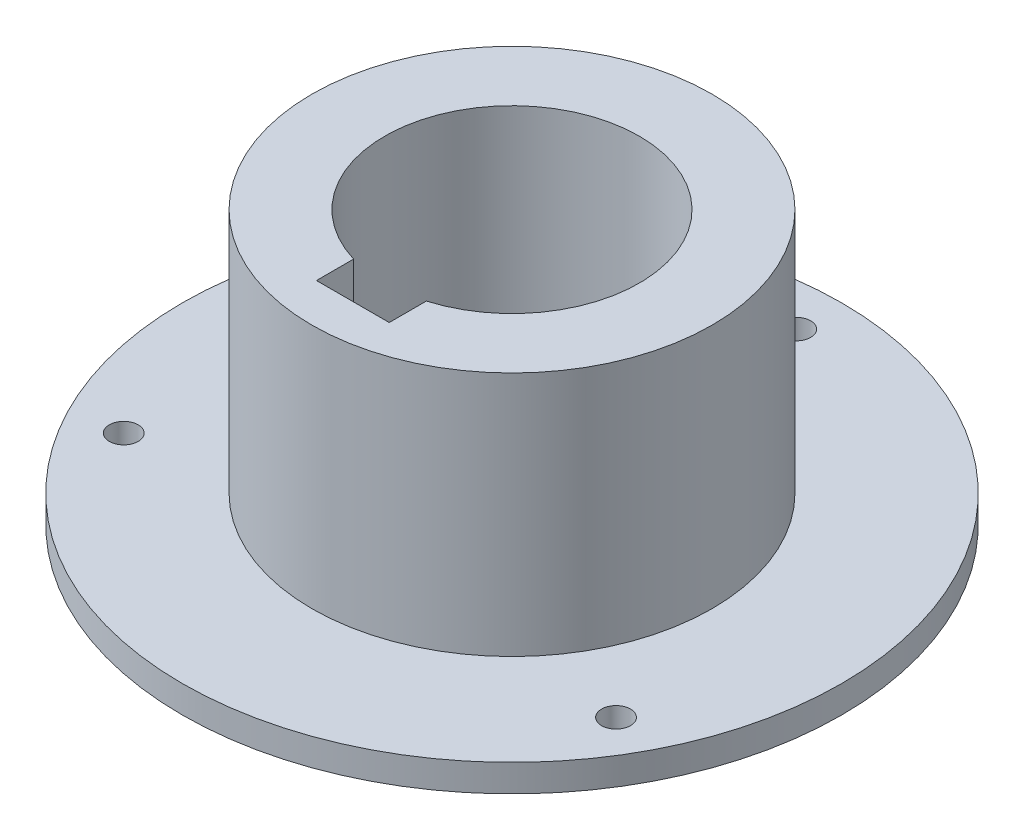
ISO-10303-21;
HEADER;
FILE_DESCRIPTION(('STEP AP214'),'2;1');
FILE_NAME('part.step','',(''),(''),'','','');
FILE_SCHEMA(('AUTOMOTIVE_DESIGN { 1 0 10303 214 1 1 1 1 }'));
ENDSEC;
DATA;
#1=APPLICATION_CONTEXT('core data for automotive mechanical design processes');
#2=APPLICATION_PROTOCOL_DEFINITION('international standard','automotive_design',2000,#1);
#3=PRODUCT_CONTEXT('',#1,'mechanical');
#4=PRODUCT('Part','Part','',(#3));
#5=PRODUCT_RELATED_PRODUCT_CATEGORY('part','',(#4));
#6=PRODUCT_DEFINITION_FORMATION('','',#4);
#7=PRODUCT_DEFINITION_CONTEXT('part definition',#1,'design');
#8=PRODUCT_DEFINITION('design','',#6,#7);
#9=PRODUCT_DEFINITION_SHAPE('','',#8);
#10=(LENGTH_UNIT() NAMED_UNIT(*) SI_UNIT(.MILLI.,.METRE.));
#11=(NAMED_UNIT(*) PLANE_ANGLE_UNIT() SI_UNIT($,.RADIAN.));
#12=(NAMED_UNIT(*) SI_UNIT($,.STERADIAN.) SOLID_ANGLE_UNIT());
#13=UNCERTAINTY_MEASURE_WITH_UNIT(LENGTH_MEASURE(1.E-05),#10,'distance_accuracy_value','');
#14=(GEOMETRIC_REPRESENTATION_CONTEXT(3) GLOBAL_UNCERTAINTY_ASSIGNED_CONTEXT((#13)) GLOBAL_UNIT_ASSIGNED_CONTEXT((#10,
#11,#12)) REPRESENTATION_CONTEXT('',''));
#15=CARTESIAN_POINT('',(0.,0.,0.));
#16=DIRECTION('',(0.,0.,1.));
#17=DIRECTION('',(1.,0.,0.));
#18=AXIS2_PLACEMENT_3D('',#15,#16,#17);
#19=CARTESIAN_POINT('',(0.,30.,0.));
#20=DIRECTION('',(0.,-1.,0.));
#21=DIRECTION('',(0.,0.,-1.));
#22=AXIS2_PLACEMENT_3D('',#19,#20,#21);
#23=PLANE('',#22);
#24=CARTESIAN_POINT('',(0.,30.,0.));
#25=DIRECTION('',(0.,-1.,0.));
#26=DIRECTION('',(0.,0.,-1.));
#27=AXIS2_PLACEMENT_3D('',#24,#25,#26);
#28=CIRCLE('',#27,22.);
#29=CARTESIAN_POINT('',(0.,30.,-22.));
#30=VERTEX_POINT('',#29);
#31=EDGE_CURVE('E114',#30,#30,#28,.T.);
#32=ORIENTED_EDGE('',*,*,#31,.F.);
#33=EDGE_LOOP('',(#32));
#34=FACE_BOUND('',#33,.T.);
#35=DIRECTION('',(1.,0.,0.));
#36=VECTOR('',#35,1.);
#37=CARTESIAN_POINT('',(0.,30.,17.5));
#38=LINE('',#37,#36);
#39=CARTESIAN_POINT('',(-4.,30.,17.5));
#40=VERTEX_POINT('',#39);
#41=CARTESIAN_POINT('',(4.,30.,17.5));
#42=VERTEX_POINT('',#41);
#43=EDGE_CURVE('E142',#40,#42,#38,.T.);
#44=ORIENTED_EDGE('',*,*,#43,.F.);
#45=DIRECTION('',(0.,0.,1.));
#46=VECTOR('',#45,1.);
#47=CARTESIAN_POINT('',(-4.,30.,17.5));
#48=LINE('',#47,#46);
#49=CARTESIAN_POINT('',(-4.,30.,13.4164078649987));
#50=VERTEX_POINT('',#49);
#51=EDGE_CURVE('E77',#50,#40,#48,.T.);
#52=ORIENTED_EDGE('',*,*,#51,.F.);
#53=CARTESIAN_POINT('',(0.,30.,0.));
#54=DIRECTION('',(0.,-1.,0.));
#55=DIRECTION('',(0.,0.,-1.));
#56=AXIS2_PLACEMENT_3D('',#53,#54,#55);
#57=CIRCLE('',#56,14.);
#58=CARTESIAN_POINT('',(4.,30.,13.4164078649987));
#59=VERTEX_POINT('',#58);
#60=EDGE_CURVE('E44',#50,#59,#57,.T.);
#61=ORIENTED_EDGE('',*,*,#60,.T.);
#62=DIRECTION('',(0.,0.,-1.));
#63=VECTOR('',#62,1.);
#64=CARTESIAN_POINT('',(4.,30.,12.9194536976706));
#65=LINE('',#64,#63);
#66=EDGE_CURVE('E140',#42,#59,#65,.T.);
#67=ORIENTED_EDGE('',*,*,#66,.F.);
#68=EDGE_LOOP('',(#44,#52,#61,#67));
#69=FACE_BOUND('',#68,.T.);
#70=ADVANCED_FACE('F37',(#34,#69),#23,.F.);
#71=CARTESIAN_POINT('',(0.,0.,0.));
#72=DIRECTION('',(0.,-1.,0.));
#73=DIRECTION('',(0.,0.,-1.));
#74=AXIS2_PLACEMENT_3D('',#71,#72,#73);
#75=CYLINDRICAL_SURFACE('',#74,14.);
#76=ORIENTED_EDGE('',*,*,#60,.F.);
#77=DIRECTION('',(0.,-1.,0.));
#78=VECTOR('',#77,1.);
#79=CARTESIAN_POINT('',(-4.,0.,13.4164078649987));
#80=LINE('',#79,#78);
#81=CARTESIAN_POINT('',(-4.,-2.,13.4164078649987));
#82=VERTEX_POINT('',#81);
#83=EDGE_CURVE('E135',#50,#82,#80,.T.);
#84=ORIENTED_EDGE('',*,*,#83,.T.);
#85=CARTESIAN_POINT('',(0.,-2.,0.));
#86=DIRECTION('',(0.,-1.,0.));
#87=DIRECTION('',(0.,0.,-1.));
#88=AXIS2_PLACEMENT_3D('',#85,#86,#87);
#89=CIRCLE('',#88,14.);
#90=CARTESIAN_POINT('',(4.,-2.,13.4164078649987));
#91=VERTEX_POINT('',#90);
#92=EDGE_CURVE('E93',#82,#91,#89,.T.);
#93=ORIENTED_EDGE('',*,*,#92,.T.);
#94=DIRECTION('',(0.,-1.,0.));
#95=VECTOR('',#94,1.);
#96=CARTESIAN_POINT('',(4.,0.,13.4164078649987));
#97=LINE('',#96,#95);
#98=EDGE_CURVE('E81',#91,#59,#97,.F.);
#99=ORIENTED_EDGE('',*,*,#98,.T.);
#100=EDGE_LOOP('',(#76,#84,#93,#99));
#101=FACE_BOUND('',#100,.T.);
#102=ADVANCED_FACE('F148',(#101),#75,.F.);
#103=CARTESIAN_POINT('',(0.,-2.,0.));
#104=DIRECTION('',(0.,1.,0.));
#105=DIRECTION('',(0.,0.,1.));
#106=AXIS2_PLACEMENT_3D('',#103,#104,#105);
#107=PLANE('',#106);
#108=ORIENTED_EDGE('',*,*,#92,.F.);
#109=DIRECTION('',(0.,0.,1.));
#110=VECTOR('',#109,1.);
#111=CARTESIAN_POINT('',(-4.,-2.,0.));
#112=LINE('',#111,#110);
#113=CARTESIAN_POINT('',(-4.,-2.,17.5));
#114=VERTEX_POINT('',#113);
#115=EDGE_CURVE('E11',#82,#114,#112,.T.);
#116=ORIENTED_EDGE('',*,*,#115,.T.);
#117=DIRECTION('',(1.,0.,0.));
#118=VECTOR('',#117,1.);
#119=CARTESIAN_POINT('',(0.,-2.,17.5));
#120=LINE('',#119,#118);
#121=CARTESIAN_POINT('',(4.,-2.,17.5));
#122=VERTEX_POINT('',#121);
#123=EDGE_CURVE('E85',#114,#122,#120,.T.);
#124=ORIENTED_EDGE('',*,*,#123,.T.);
#125=DIRECTION('',(0.,0.,-1.));
#126=VECTOR('',#125,1.);
#127=CARTESIAN_POINT('',(4.,-2.,12.9194536976706));
#128=LINE('',#127,#126);
#129=EDGE_CURVE('E51',#122,#91,#128,.T.);
#130=ORIENTED_EDGE('',*,*,#129,.T.);
#131=EDGE_LOOP('',(#108,#116,#124,#130));
#132=FACE_BOUND('',#131,.T.);
#133=CARTESIAN_POINT('',(0.,-2.,0.));
#134=DIRECTION('',(0.,-1.,0.));
#135=DIRECTION('',(0.,0.,-1.));
#136=AXIS2_PLACEMENT_3D('',#133,#134,#135);
#137=CIRCLE('',#136,19.25);
#138=CARTESIAN_POINT('',(0.,-2.,-19.25));
#139=VERTEX_POINT('',#138);
#140=EDGE_CURVE('E96',#139,#139,#137,.T.);
#141=ORIENTED_EDGE('',*,*,#140,.T.);
#142=EDGE_LOOP('',(#141));
#143=FACE_BOUND('',#142,.T.);
#144=ADVANCED_FACE('F90',(#132,#143),#107,.F.);
#145=CARTESIAN_POINT('',(0.,0.,0.));
#146=DIRECTION('',(0.,-1.,0.));
#147=DIRECTION('',(0.,0.,-1.));
#148=AXIS2_PLACEMENT_3D('',#145,#146,#147);
#149=CYLINDRICAL_SURFACE('',#148,19.25);
#150=CARTESIAN_POINT('',(0.,0.,0.));
#151=DIRECTION('',(0.,-1.,0.));
#152=DIRECTION('',(0.,0.,-1.));
#153=AXIS2_PLACEMENT_3D('',#150,#151,#152);
#154=CIRCLE('',#153,19.25);
#155=CARTESIAN_POINT('',(0.,0.,-19.25));
#156=VERTEX_POINT('',#155);
#157=EDGE_CURVE('E100',#156,#156,#154,.T.);
#158=ORIENTED_EDGE('',*,*,#157,.T.);
#159=EDGE_LOOP('',(#158));
#160=FACE_BOUND('',#159,.T.);
#161=ORIENTED_EDGE('',*,*,#140,.F.);
#162=EDGE_LOOP('',(#161));
#163=FACE_BOUND('',#162,.T.);
#164=ADVANCED_FACE('F154',(#160,#163),#149,.T.);
#165=CARTESIAN_POINT('',(0.,0.,0.));
#166=DIRECTION('',(0.,-1.,0.));
#167=DIRECTION('',(0.,0.,-1.));
#168=AXIS2_PLACEMENT_3D('',#165,#166,#167);
#169=PLANE('',#168);
#170=CARTESIAN_POINT('',(-27.0632938682639,0.,15.6249999999997));
#171=DIRECTION('',(0.,-1.,0.));
#172=DIRECTION('',(0.,0.,-1.));
#173=AXIS2_PLACEMENT_3D('',#170,#171,#172);
#174=CIRCLE('',#173,1.5875);
#175=CARTESIAN_POINT('',(-27.0632938682639,0.,14.0374999999997));
#176=VERTEX_POINT('',#175);
#177=EDGE_CURVE('E129',#176,#176,#174,.T.);
#178=ORIENTED_EDGE('',*,*,#177,.F.);
#179=EDGE_LOOP('',(#178));
#180=FACE_BOUND('',#179,.T.);
#181=CARTESIAN_POINT('',(27.0632938682636,0.,15.6250000000001));
#182=DIRECTION('',(0.,-1.,0.));
#183=DIRECTION('',(0.,0.,-1.));
#184=AXIS2_PLACEMENT_3D('',#181,#182,#183);
#185=CIRCLE('',#184,1.5875);
#186=CARTESIAN_POINT('',(27.0632938682636,0.,14.0375000000001));
#187=VERTEX_POINT('',#186);
#188=EDGE_CURVE('E123',#187,#187,#185,.T.);
#189=ORIENTED_EDGE('',*,*,#188,.F.);
#190=EDGE_LOOP('',(#189));
#191=FACE_BOUND('',#190,.T.);
#192=CARTESIAN_POINT('',(0.,0.,-31.25));
#193=DIRECTION('',(0.,-1.,0.));
#194=DIRECTION('',(0.,0.,-1.));
#195=AXIS2_PLACEMENT_3D('',#192,#193,#194);
#196=CIRCLE('',#195,1.5875);
#197=CARTESIAN_POINT('',(0.,0.,-32.8375));
#198=VERTEX_POINT('',#197);
#199=EDGE_CURVE('E117',#198,#198,#196,.T.);
#200=ORIENTED_EDGE('',*,*,#199,.F.);
#201=EDGE_LOOP('',(#200));
#202=FACE_BOUND('',#201,.T.);
#203=CARTESIAN_POINT('',(0.,0.,0.));
#204=DIRECTION('',(0.,-1.,0.));
#205=DIRECTION('',(0.,0.,-1.));
#206=AXIS2_PLACEMENT_3D('',#203,#204,#205);
#207=CIRCLE('',#206,36.25);
#208=CARTESIAN_POINT('',(0.,0.,-36.25));
#209=VERTEX_POINT('',#208);
#210=EDGE_CURVE('E105',#209,#209,#207,.T.);
#211=ORIENTED_EDGE('',*,*,#210,.T.);
#212=EDGE_LOOP('',(#211));
#213=FACE_BOUND('',#212,.T.);
#214=ORIENTED_EDGE('',*,*,#157,.F.);
#215=EDGE_LOOP('',(#214));
#216=FACE_BOUND('',#215,.T.);
#217=ADVANCED_FACE('F160',(#180,#191,#202,#213,#216),#169,.T.);
#218=CARTESIAN_POINT('',(0.,0.,0.));
#219=DIRECTION('',(0.,-1.,0.));
#220=DIRECTION('',(0.,0.,-1.));
#221=AXIS2_PLACEMENT_3D('',#218,#219,#220);
#222=CYLINDRICAL_SURFACE('',#221,36.25);
#223=ORIENTED_EDGE('',*,*,#210,.F.);
#224=EDGE_LOOP('',(#223));
#225=FACE_BOUND('',#224,.T.);
#226=CARTESIAN_POINT('',(0.,3.,0.));
#227=DIRECTION('',(0.,-1.,0.));
#228=DIRECTION('',(0.,0.,-1.));
#229=AXIS2_PLACEMENT_3D('',#226,#227,#228);
#230=CIRCLE('',#229,36.25);
#231=CARTESIAN_POINT('',(0.,3.,-36.25));
#232=VERTEX_POINT('',#231);
#233=EDGE_CURVE('E108',#232,#232,#230,.T.);
#234=ORIENTED_EDGE('',*,*,#233,.T.);
#235=EDGE_LOOP('',(#234));
#236=FACE_BOUND('',#235,.T.);
#237=ADVANCED_FACE('F164',(#225,#236),#222,.T.);
#238=CARTESIAN_POINT('',(0.,3.,0.));
#239=DIRECTION('',(0.,-1.,0.));
#240=DIRECTION('',(0.,0.,-1.));
#241=AXIS2_PLACEMENT_3D('',#238,#239,#240);
#242=PLANE('',#241);
#243=CARTESIAN_POINT('',(-27.0632938682639,3.,15.6249999999997));
#244=DIRECTION('',(0.,1.,0.));
#245=DIRECTION('',(0.,0.,1.));
#246=AXIS2_PLACEMENT_3D('',#243,#244,#245);
#247=CIRCLE('',#246,1.5875);
#248=CARTESIAN_POINT('',(-27.0632938682639,3.,17.2124999999997));
#249=VERTEX_POINT('',#248);
#250=EDGE_CURVE('E132',#249,#249,#247,.T.);
#251=ORIENTED_EDGE('',*,*,#250,.F.);
#252=EDGE_LOOP('',(#251));
#253=FACE_BOUND('',#252,.T.);
#254=CARTESIAN_POINT('',(27.0632938682636,3.,15.6250000000001));
#255=DIRECTION('',(0.,1.,0.));
#256=DIRECTION('',(0.,0.,1.));
#257=AXIS2_PLACEMENT_3D('',#254,#255,#256);
#258=CIRCLE('',#257,1.5875);
#259=CARTESIAN_POINT('',(27.0632938682636,3.,17.2125000000001));
#260=VERTEX_POINT('',#259);
#261=EDGE_CURVE('E126',#260,#260,#258,.T.);
#262=ORIENTED_EDGE('',*,*,#261,.F.);
#263=EDGE_LOOP('',(#262));
#264=FACE_BOUND('',#263,.T.);
#265=CARTESIAN_POINT('',(0.,3.,-31.25));
#266=DIRECTION('',(0.,1.,0.));
#267=DIRECTION('',(0.,0.,1.));
#268=AXIS2_PLACEMENT_3D('',#265,#266,#267);
#269=CIRCLE('',#268,1.5875);
#270=CARTESIAN_POINT('',(0.,3.,-29.6625));
#271=VERTEX_POINT('',#270);
#272=EDGE_CURVE('E120',#271,#271,#269,.T.);
#273=ORIENTED_EDGE('',*,*,#272,.F.);
#274=EDGE_LOOP('',(#273));
#275=FACE_BOUND('',#274,.T.);
#276=ORIENTED_EDGE('',*,*,#233,.F.);
#277=EDGE_LOOP('',(#276));
#278=FACE_BOUND('',#277,.T.);
#279=CARTESIAN_POINT('',(0.,3.,0.));
#280=DIRECTION('',(0.,-1.,0.));
#281=DIRECTION('',(0.,0.,-1.));
#282=AXIS2_PLACEMENT_3D('',#279,#280,#281);
#283=CIRCLE('',#282,22.);
#284=CARTESIAN_POINT('',(0.,3.,-22.));
#285=VERTEX_POINT('',#284);
#286=EDGE_CURVE('E111',#285,#285,#283,.T.);
#287=ORIENTED_EDGE('',*,*,#286,.T.);
#288=EDGE_LOOP('',(#287));
#289=FACE_BOUND('',#288,.T.);
#290=ADVANCED_FACE('F168',(#253,#264,#275,#278,#289),#242,.F.);
#291=CARTESIAN_POINT('',(0.,0.,0.));
#292=DIRECTION('',(0.,-1.,0.));
#293=DIRECTION('',(0.,0.,-1.));
#294=AXIS2_PLACEMENT_3D('',#291,#292,#293);
#295=CYLINDRICAL_SURFACE('',#294,22.);
#296=ORIENTED_EDGE('',*,*,#286,.F.);
#297=EDGE_LOOP('',(#296));
#298=FACE_BOUND('',#297,.T.);
#299=ORIENTED_EDGE('',*,*,#31,.T.);
#300=EDGE_LOOP('',(#299));
#301=FACE_BOUND('',#300,.T.);
#302=ADVANCED_FACE('F172',(#298,#301),#295,.T.);
#303=CARTESIAN_POINT('',(0.,3.,-31.25));
#304=DIRECTION('',(0.,1.,0.));
#305=DIRECTION('',(0.,0.,1.));
#306=AXIS2_PLACEMENT_3D('',#303,#304,#305);
#307=CYLINDRICAL_SURFACE('',#306,1.5875);
#308=ORIENTED_EDGE('',*,*,#199,.T.);
#309=EDGE_LOOP('',(#308));
#310=FACE_BOUND('',#309,.T.);
#311=ORIENTED_EDGE('',*,*,#272,.T.);
#312=EDGE_LOOP('',(#311));
#313=FACE_BOUND('',#312,.T.);
#314=ADVANCED_FACE('F176',(#310,#313),#307,.F.);
#315=CARTESIAN_POINT('',(27.0632938682636,3.,15.6250000000001));
#316=DIRECTION('',(0.,1.,0.));
#317=DIRECTION('',(0.,0.,1.));
#318=AXIS2_PLACEMENT_3D('',#315,#316,#317);
#319=CYLINDRICAL_SURFACE('',#318,1.5875);
#320=ORIENTED_EDGE('',*,*,#188,.T.);
#321=EDGE_LOOP('',(#320));
#322=FACE_BOUND('',#321,.T.);
#323=ORIENTED_EDGE('',*,*,#261,.T.);
#324=EDGE_LOOP('',(#323));
#325=FACE_BOUND('',#324,.T.);
#326=ADVANCED_FACE('F180',(#322,#325),#319,.F.);
#327=CARTESIAN_POINT('',(-27.0632938682639,3.,15.6249999999997));
#328=DIRECTION('',(0.,1.,0.));
#329=DIRECTION('',(0.,0.,1.));
#330=AXIS2_PLACEMENT_3D('',#327,#328,#329);
#331=CYLINDRICAL_SURFACE('',#330,1.5875);
#332=ORIENTED_EDGE('',*,*,#177,.T.);
#333=EDGE_LOOP('',(#332));
#334=FACE_BOUND('',#333,.T.);
#335=ORIENTED_EDGE('',*,*,#250,.T.);
#336=EDGE_LOOP('',(#335));
#337=FACE_BOUND('',#336,.T.);
#338=ADVANCED_FACE('F184',(#334,#337),#331,.F.);
#339=CARTESIAN_POINT('',(-4.,-2.,17.5));
#340=DIRECTION('',(-1.,0.,0.));
#341=DIRECTION('',(0.,0.,1.));
#342=AXIS2_PLACEMENT_3D('',#339,#340,#341);
#343=PLANE('',#342);
#344=ORIENTED_EDGE('',*,*,#51,.T.);
#345=DIRECTION('',(0.,1.,0.));
#346=VECTOR('',#345,1.);
#347=CARTESIAN_POINT('',(-4.,-2.,17.5));
#348=LINE('',#347,#346);
#349=EDGE_CURVE('E73',#114,#40,#348,.T.);
#350=ORIENTED_EDGE('',*,*,#349,.F.);
#351=ORIENTED_EDGE('',*,*,#115,.F.);
#352=ORIENTED_EDGE('',*,*,#83,.F.);
#353=EDGE_LOOP('',(#344,#350,#351,#352));
#354=FACE_BOUND('',#353,.T.);
#355=ADVANCED_FACE('F75',(#354),#343,.F.);
#356=CARTESIAN_POINT('',(4.,-2.,12.9194536976706));
#357=DIRECTION('',(1.,0.,0.));
#358=DIRECTION('',(0.,0.,-1.));
#359=AXIS2_PLACEMENT_3D('',#356,#357,#358);
#360=PLANE('',#359);
#361=ORIENTED_EDGE('',*,*,#129,.F.);
#362=DIRECTION('',(0.,1.,0.));
#363=VECTOR('',#362,1.);
#364=CARTESIAN_POINT('',(4.,-2.,17.5));
#365=LINE('',#364,#363);
#366=EDGE_CURVE('E82',#122,#42,#365,.T.);
#367=ORIENTED_EDGE('',*,*,#366,.T.);
#368=ORIENTED_EDGE('',*,*,#66,.T.);
#369=ORIENTED_EDGE('',*,*,#98,.F.);
#370=EDGE_LOOP('',(#361,#367,#368,#369));
#371=FACE_BOUND('',#370,.T.);
#372=ADVANCED_FACE('F147',(#371),#360,.F.);
#373=CARTESIAN_POINT('',(0.,-2.,17.5));
#374=DIRECTION('',(0.,0.,1.));
#375=DIRECTION('',(1.,0.,0.));
#376=AXIS2_PLACEMENT_3D('',#373,#374,#375);
#377=PLANE('',#376);
#378=ORIENTED_EDGE('',*,*,#43,.T.);
#379=ORIENTED_EDGE('',*,*,#366,.F.);
#380=ORIENTED_EDGE('',*,*,#123,.F.);
#381=ORIENTED_EDGE('',*,*,#349,.T.);
#382=EDGE_LOOP('',(#378,#379,#380,#381));
#383=FACE_BOUND('',#382,.T.);
#384=ADVANCED_FACE('F86',(#383),#377,.F.);
#385=CLOSED_SHELL('',(#70,#102,#144,#164,#217,#237,#290,#302,#314,#326,#338,#355,#372,#384));
#386=MANIFOLD_SOLID_BREP('B2',#385);
#387=ADVANCED_BREP_SHAPE_REPRESENTATION('',(#18,#386),#14);
#388=SHAPE_DEFINITION_REPRESENTATION(#9,#387);
ENDSEC;
END-ISO-10303-21;
